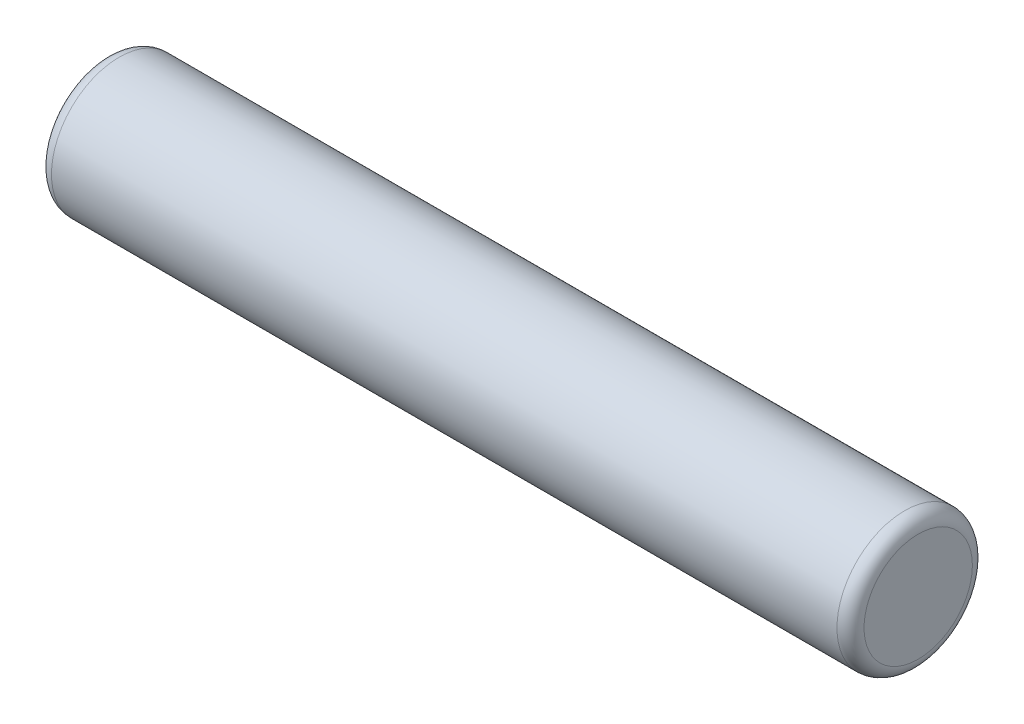
ISO-10303-21;
HEADER;
FILE_DESCRIPTION(('STEP AP214'),'2;1');
FILE_NAME('part.step','',(''),(''),'','','');
FILE_SCHEMA(('AUTOMOTIVE_DESIGN { 1 0 10303 214 1 1 1 1 }'));
ENDSEC;
DATA;
#1=APPLICATION_CONTEXT('core data for automotive mechanical design processes');
#2=APPLICATION_PROTOCOL_DEFINITION('international standard','automotive_design',2000,#1);
#3=PRODUCT_CONTEXT('',#1,'mechanical');
#4=PRODUCT('Part','Part','',(#3));
#5=PRODUCT_RELATED_PRODUCT_CATEGORY('part','',(#4));
#6=PRODUCT_DEFINITION_FORMATION('','',#4);
#7=PRODUCT_DEFINITION_CONTEXT('part definition',#1,'design');
#8=PRODUCT_DEFINITION('design','',#6,#7);
#9=PRODUCT_DEFINITION_SHAPE('','',#8);
#10=(LENGTH_UNIT() NAMED_UNIT(*) SI_UNIT(.MILLI.,.METRE.));
#11=(NAMED_UNIT(*) PLANE_ANGLE_UNIT() SI_UNIT($,.RADIAN.));
#12=(NAMED_UNIT(*) SI_UNIT($,.STERADIAN.) SOLID_ANGLE_UNIT());
#13=UNCERTAINTY_MEASURE_WITH_UNIT(LENGTH_MEASURE(1.E-05),#10,'distance_accuracy_value','');
#14=(GEOMETRIC_REPRESENTATION_CONTEXT(3) GLOBAL_UNCERTAINTY_ASSIGNED_CONTEXT((#13)) GLOBAL_UNIT_ASSIGNED_CONTEXT((#10,
#11,#12)) REPRESENTATION_CONTEXT('',''));
#15=CARTESIAN_POINT('',(0.,0.,0.));
#16=DIRECTION('',(0.,0.,1.));
#17=DIRECTION('',(1.,0.,0.));
#18=AXIS2_PLACEMENT_3D('',#15,#16,#17);
#19=CARTESIAN_POINT('',(60.,0.,0.));
#20=DIRECTION('',(-1.,0.,0.));
#21=DIRECTION('',(0.,0.,1.));
#22=AXIS2_PLACEMENT_3D('',#19,#20,#21);
#23=CYLINDRICAL_SURFACE('',#22,5.);
#24=CARTESIAN_POINT('',(1.,0.,0.));
#25=DIRECTION('',(1.,0.,0.));
#26=DIRECTION('',(0.,0.,-1.));
#27=AXIS2_PLACEMENT_3D('',#24,#25,#26);
#28=CIRCLE('',#27,5.);
#29=CARTESIAN_POINT('',(1.,0.,-5.));
#30=VERTEX_POINT('',#29);
#31=EDGE_CURVE('E42',#30,#30,#28,.T.);
#32=ORIENTED_EDGE('',*,*,#31,.T.);
#33=EDGE_LOOP('',(#32));
#34=FACE_BOUND('',#33,.T.);
#35=CARTESIAN_POINT('',(59.,0.,0.));
#36=DIRECTION('',(1.,0.,0.));
#37=DIRECTION('',(0.,0.,-1.));
#38=AXIS2_PLACEMENT_3D('',#35,#36,#37);
#39=CIRCLE('',#38,5.);
#40=CARTESIAN_POINT('',(59.,0.,-5.));
#41=VERTEX_POINT('',#40);
#42=EDGE_CURVE('E46',#41,#41,#39,.F.);
#43=ORIENTED_EDGE('',*,*,#42,.T.);
#44=EDGE_LOOP('',(#43));
#45=FACE_BOUND('',#44,.T.);
#46=ADVANCED_FACE('F31',(#34,#45),#23,.T.);
#47=CARTESIAN_POINT('',(60.,0.,0.));
#48=DIRECTION('',(1.,0.,0.));
#49=DIRECTION('',(0.,0.,-1.));
#50=AXIS2_PLACEMENT_3D('',#47,#48,#49);
#51=PLANE('',#50);
#52=CARTESIAN_POINT('',(60.,0.,0.));
#53=DIRECTION('',(1.,0.,0.));
#54=DIRECTION('',(0.,0.,-1.));
#55=AXIS2_PLACEMENT_3D('',#52,#53,#54);
#56=CIRCLE('',#55,4.);
#57=CARTESIAN_POINT('',(60.,0.,-4.));
#58=VERTEX_POINT('',#57);
#59=EDGE_CURVE('E10',#58,#58,#56,.T.);
#60=ORIENTED_EDGE('',*,*,#59,.T.);
#61=EDGE_LOOP('',(#60));
#62=FACE_BOUND('',#61,.T.);
#63=ADVANCED_FACE('F62',(#62),#51,.T.);
#64=CARTESIAN_POINT('',(0.,0.,0.));
#65=DIRECTION('',(1.,0.,0.));
#66=DIRECTION('',(0.,0.,-1.));
#67=AXIS2_PLACEMENT_3D('',#64,#65,#66);
#68=PLANE('',#67);
#69=CARTESIAN_POINT('',(0.,0.,0.));
#70=DIRECTION('',(1.,0.,0.));
#71=DIRECTION('',(0.,0.,-1.));
#72=AXIS2_PLACEMENT_3D('',#69,#70,#71);
#73=CIRCLE('',#72,4.);
#74=CARTESIAN_POINT('',(0.,0.,-4.));
#75=VERTEX_POINT('',#74);
#76=EDGE_CURVE('E38',#75,#75,#73,.F.);
#77=ORIENTED_EDGE('',*,*,#76,.T.);
#78=EDGE_LOOP('',(#77));
#79=FACE_BOUND('',#78,.T.);
#80=ADVANCED_FACE('F59',(#79),#68,.F.);
#81=CARTESIAN_POINT('',(1.,0.,0.));
#82=DIRECTION('',(1.,0.,0.));
#83=DIRECTION('',(0.,0.,-1.));
#84=AXIS2_PLACEMENT_3D('',#81,#82,#83);
#85=TOROIDAL_SURFACE('',#84,4.,1.);
#86=ORIENTED_EDGE('',*,*,#76,.F.);
#87=EDGE_LOOP('',(#86));
#88=FACE_BOUND('',#87,.T.);
#89=ORIENTED_EDGE('',*,*,#31,.F.);
#90=EDGE_LOOP('',(#89));
#91=FACE_BOUND('',#90,.T.);
#92=ADVANCED_FACE('F55',(#88,#91),#85,.T.);
#93=CARTESIAN_POINT('',(59.,0.,0.));
#94=DIRECTION('',(1.,0.,0.));
#95=DIRECTION('',(0.,0.,-1.));
#96=AXIS2_PLACEMENT_3D('',#93,#94,#95);
#97=TOROIDAL_SURFACE('',#96,4.,1.);
#98=ORIENTED_EDGE('',*,*,#42,.F.);
#99=EDGE_LOOP('',(#98));
#100=FACE_BOUND('',#99,.T.);
#101=ORIENTED_EDGE('',*,*,#59,.F.);
#102=EDGE_LOOP('',(#101));
#103=FACE_BOUND('',#102,.T.);
#104=ADVANCED_FACE('F33',(#100,#103),#97,.T.);
#105=CLOSED_SHELL('',(#46,#63,#80,#92,#104));
#106=MANIFOLD_SOLID_BREP('B2',#105);
#107=ADVANCED_BREP_SHAPE_REPRESENTATION('',(#18,#106),#14);
#108=SHAPE_DEFINITION_REPRESENTATION(#9,#107);
ENDSEC;
END-ISO-10303-21;
